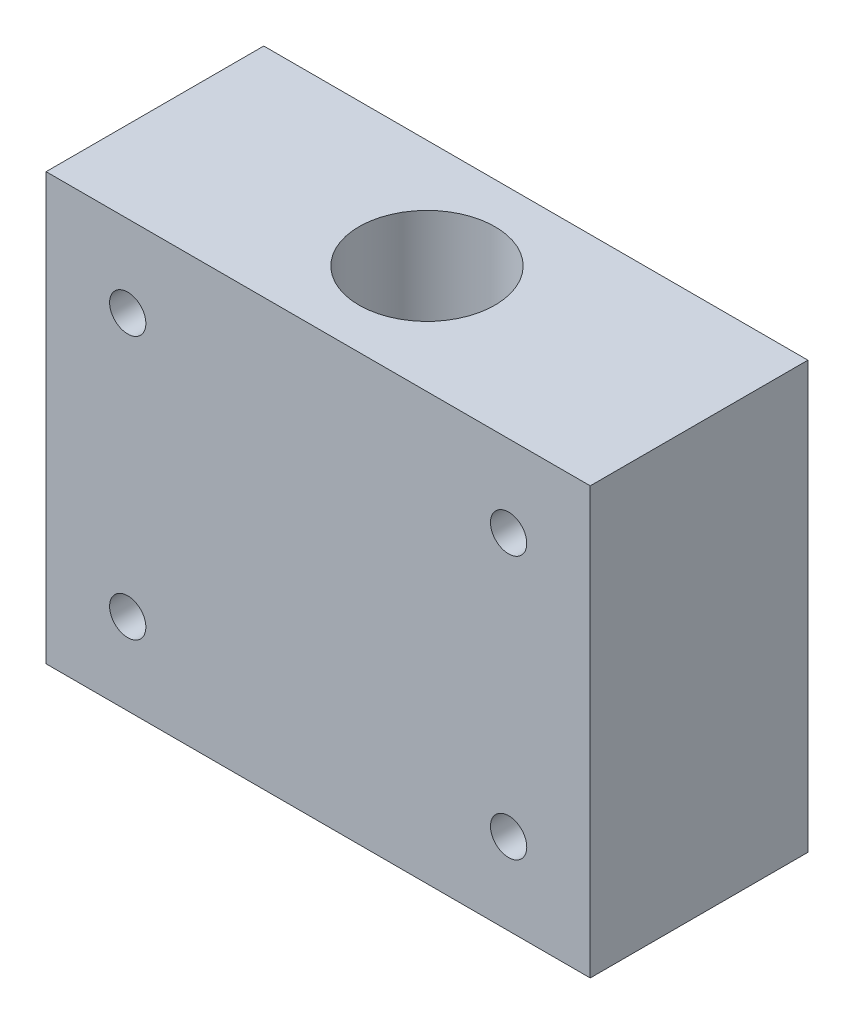
ISO-10303-21;
HEADER;
FILE_DESCRIPTION(('STEP AP214'),'2;1');
FILE_NAME('part.step','',(''),(''),'','','');
FILE_SCHEMA(('AUTOMOTIVE_DESIGN { 1 0 10303 214 1 1 1 1 }'));
ENDSEC;
DATA;
#1=APPLICATION_CONTEXT('core data for automotive mechanical design processes');
#2=APPLICATION_PROTOCOL_DEFINITION('international standard','automotive_design',2000,#1);
#3=PRODUCT_CONTEXT('',#1,'mechanical');
#4=PRODUCT('Part','Part','',(#3));
#5=PRODUCT_RELATED_PRODUCT_CATEGORY('part','',(#4));
#6=PRODUCT_DEFINITION_FORMATION('','',#4);
#7=PRODUCT_DEFINITION_CONTEXT('part definition',#1,'design');
#8=PRODUCT_DEFINITION('design','',#6,#7);
#9=PRODUCT_DEFINITION_SHAPE('','',#8);
#10=(LENGTH_UNIT() NAMED_UNIT(*) SI_UNIT(.MILLI.,.METRE.));
#11=(NAMED_UNIT(*) PLANE_ANGLE_UNIT() SI_UNIT($,.RADIAN.));
#12=(NAMED_UNIT(*) SI_UNIT($,.STERADIAN.) SOLID_ANGLE_UNIT());
#13=UNCERTAINTY_MEASURE_WITH_UNIT(LENGTH_MEASURE(1.E-05),#10,'distance_accuracy_value','');
#14=(GEOMETRIC_REPRESENTATION_CONTEXT(3) GLOBAL_UNCERTAINTY_ASSIGNED_CONTEXT((#13)) GLOBAL_UNIT_ASSIGNED_CONTEXT((#10,
#11,#12)) REPRESENTATION_CONTEXT('',''));
#15=CARTESIAN_POINT('',(0.,0.,0.));
#16=DIRECTION('',(0.,0.,1.));
#17=DIRECTION('',(1.,0.,0.));
#18=AXIS2_PLACEMENT_3D('',#15,#16,#17);
#19=CARTESIAN_POINT('',(0.,47.,0.));
#20=DIRECTION('',(0.,-1.,0.));
#21=DIRECTION('',(0.,0.,-1.));
#22=AXIS2_PLACEMENT_3D('',#19,#20,#21);
#23=PLANE('',#22);
#24=DIRECTION('',(0.,0.,-1.));
#25=VECTOR('',#24,1.);
#26=CARTESIAN_POINT('',(30.,47.,12.));
#27=LINE('',#26,#25);
#28=CARTESIAN_POINT('',(30.,47.,12.));
#29=VERTEX_POINT('',#28);
#30=CARTESIAN_POINT('',(30.,47.,-12.));
#31=VERTEX_POINT('',#30);
#32=EDGE_CURVE('E84',#29,#31,#27,.T.);
#33=ORIENTED_EDGE('',*,*,#32,.T.);
#34=DIRECTION('',(-1.,0.,0.));
#35=VECTOR('',#34,1.);
#36=CARTESIAN_POINT('',(-30.,47.,-12.));
#37=LINE('',#36,#35);
#38=CARTESIAN_POINT('',(-30.,47.,-12.));
#39=VERTEX_POINT('',#38);
#40=EDGE_CURVE('E80',#31,#39,#37,.T.);
#41=ORIENTED_EDGE('',*,*,#40,.T.);
#42=DIRECTION('',(0.,0.,1.));
#43=VECTOR('',#42,1.);
#44=CARTESIAN_POINT('',(-30.,47.,12.));
#45=LINE('',#44,#43);
#46=CARTESIAN_POINT('',(-30.,47.,12.));
#47=VERTEX_POINT('',#46);
#48=EDGE_CURVE('E83',#39,#47,#45,.T.);
#49=ORIENTED_EDGE('',*,*,#48,.T.);
#50=DIRECTION('',(1.,0.,0.));
#51=VECTOR('',#50,1.);
#52=CARTESIAN_POINT('',(-30.,47.,12.));
#53=LINE('',#52,#51);
#54=EDGE_CURVE('E52',#47,#29,#53,.T.);
#55=ORIENTED_EDGE('',*,*,#54,.T.);
#56=EDGE_LOOP('',(#33,#41,#49,#55));
#57=FACE_BOUND('',#56,.T.);
#58=CARTESIAN_POINT('',(0.,47.,0.));
#59=DIRECTION('',(0.,1.,0.));
#60=DIRECTION('',(0.,0.,1.));
#61=AXIS2_PLACEMENT_3D('',#58,#59,#60);
#62=CIRCLE('',#61,7.5);
#63=CARTESIAN_POINT('',(0.,47.,7.5));
#64=VERTEX_POINT('',#63);
#65=EDGE_CURVE('E100',#64,#64,#62,.T.);
#66=ORIENTED_EDGE('',*,*,#65,.F.);
#67=EDGE_LOOP('',(#66));
#68=FACE_BOUND('',#67,.T.);
#69=ADVANCED_FACE('F35',(#57,#68),#23,.F.);
#70=CARTESIAN_POINT('',(0.,0.,0.));
#71=DIRECTION('',(0.,-1.,0.));
#72=DIRECTION('',(0.,0.,-1.));
#73=AXIS2_PLACEMENT_3D('',#70,#71,#72);
#74=PLANE('',#73);
#75=DIRECTION('',(0.,0.,-1.));
#76=VECTOR('',#75,1.);
#77=CARTESIAN_POINT('',(30.,0.,12.));
#78=LINE('',#77,#76);
#79=CARTESIAN_POINT('',(30.,0.,12.));
#80=VERTEX_POINT('',#79);
#81=CARTESIAN_POINT('',(30.,0.,-12.));
#82=VERTEX_POINT('',#81);
#83=EDGE_CURVE('E98',#80,#82,#78,.T.);
#84=ORIENTED_EDGE('',*,*,#83,.F.);
#85=DIRECTION('',(1.,0.,0.));
#86=VECTOR('',#85,1.);
#87=CARTESIAN_POINT('',(-30.,0.,12.));
#88=LINE('',#87,#86);
#89=CARTESIAN_POINT('',(-30.,0.,12.));
#90=VERTEX_POINT('',#89);
#91=EDGE_CURVE('E104',#90,#80,#88,.T.);
#92=ORIENTED_EDGE('',*,*,#91,.F.);
#93=DIRECTION('',(0.,0.,1.));
#94=VECTOR('',#93,1.);
#95=CARTESIAN_POINT('',(-30.,0.,12.));
#96=LINE('',#95,#94);
#97=CARTESIAN_POINT('',(-30.,0.,-12.));
#98=VERTEX_POINT('',#97);
#99=EDGE_CURVE('E102',#98,#90,#96,.T.);
#100=ORIENTED_EDGE('',*,*,#99,.F.);
#101=DIRECTION('',(-1.,0.,0.));
#102=VECTOR('',#101,1.);
#103=CARTESIAN_POINT('',(-30.,0.,-12.));
#104=LINE('',#103,#102);
#105=EDGE_CURVE('E90',#82,#98,#104,.T.);
#106=ORIENTED_EDGE('',*,*,#105,.F.);
#107=EDGE_LOOP('',(#84,#92,#100,#106));
#108=FACE_BOUND('',#107,.T.);
#109=CARTESIAN_POINT('',(0.,0.,0.));
#110=DIRECTION('',(0.,1.,0.));
#111=DIRECTION('',(0.,0.,1.));
#112=AXIS2_PLACEMENT_3D('',#109,#110,#111);
#113=CIRCLE('',#112,7.5);
#114=CARTESIAN_POINT('',(0.,0.,7.5));
#115=VERTEX_POINT('',#114);
#116=EDGE_CURVE('E110',#115,#115,#113,.T.);
#117=ORIENTED_EDGE('',*,*,#116,.T.);
#118=EDGE_LOOP('',(#117));
#119=FACE_BOUND('',#118,.T.);
#120=ADVANCED_FACE('F175',(#108,#119),#74,.T.);
#121=CARTESIAN_POINT('',(30.,47.,12.));
#122=DIRECTION('',(-1.,0.,0.));
#123=DIRECTION('',(0.,0.,1.));
#124=AXIS2_PLACEMENT_3D('',#121,#122,#123);
#125=PLANE('',#124);
#126=ORIENTED_EDGE('',*,*,#83,.T.);
#127=DIRECTION('',(0.,-1.,0.));
#128=VECTOR('',#127,1.);
#129=CARTESIAN_POINT('',(30.,47.,-12.));
#130=LINE('',#129,#128);
#131=EDGE_CURVE('E11',#31,#82,#130,.T.);
#132=ORIENTED_EDGE('',*,*,#131,.F.);
#133=ORIENTED_EDGE('',*,*,#32,.F.);
#134=DIRECTION('',(0.,-1.,0.));
#135=VECTOR('',#134,1.);
#136=CARTESIAN_POINT('',(30.,47.,12.));
#137=LINE('',#136,#135);
#138=EDGE_CURVE('E74',#29,#80,#137,.T.);
#139=ORIENTED_EDGE('',*,*,#138,.T.);
#140=EDGE_LOOP('',(#126,#132,#133,#139));
#141=FACE_BOUND('',#140,.T.);
#142=ADVANCED_FACE('F37',(#141),#125,.F.);
#143=CARTESIAN_POINT('',(-30.,47.,-12.));
#144=DIRECTION('',(0.,0.,1.));
#145=DIRECTION('',(1.,0.,0.));
#146=AXIS2_PLACEMENT_3D('',#143,#144,#145);
#147=PLANE('',#146);
#148=CARTESIAN_POINT('',(21.,9.00000000000012,-12.));
#149=DIRECTION('',(0.,0.,1.));
#150=DIRECTION('',(1.,0.,0.));
#151=AXIS2_PLACEMENT_3D('',#148,#149,#150);
#152=CIRCLE('',#151,2.);
#153=CARTESIAN_POINT('',(23.,9.00000000000012,-12.));
#154=VERTEX_POINT('',#153);
#155=EDGE_CURVE('E131',#154,#154,#152,.T.);
#156=ORIENTED_EDGE('',*,*,#155,.T.);
#157=EDGE_LOOP('',(#156));
#158=FACE_BOUND('',#157,.T.);
#159=CARTESIAN_POINT('',(21.,37.9999999999999,-12.));
#160=DIRECTION('',(0.,0.,1.));
#161=DIRECTION('',(1.,0.,0.));
#162=AXIS2_PLACEMENT_3D('',#159,#160,#161);
#163=CIRCLE('',#162,2.);
#164=CARTESIAN_POINT('',(23.,37.9999999999999,-12.));
#165=VERTEX_POINT('',#164);
#166=EDGE_CURVE('E125',#165,#165,#163,.T.);
#167=ORIENTED_EDGE('',*,*,#166,.T.);
#168=EDGE_LOOP('',(#167));
#169=FACE_BOUND('',#168,.T.);
#170=CARTESIAN_POINT('',(-21.,37.9999999999999,-12.));
#171=DIRECTION('',(0.,0.,1.));
#172=DIRECTION('',(1.,0.,0.));
#173=AXIS2_PLACEMENT_3D('',#170,#171,#172);
#174=CIRCLE('',#173,2.);
#175=CARTESIAN_POINT('',(-19.,37.9999999999999,-12.));
#176=VERTEX_POINT('',#175);
#177=EDGE_CURVE('E119',#176,#176,#174,.T.);
#178=ORIENTED_EDGE('',*,*,#177,.T.);
#179=EDGE_LOOP('',(#178));
#180=FACE_BOUND('',#179,.T.);
#181=CARTESIAN_POINT('',(-21.,9.00000000000012,-12.));
#182=DIRECTION('',(0.,0.,1.));
#183=DIRECTION('',(1.,0.,0.));
#184=AXIS2_PLACEMENT_3D('',#181,#182,#183);
#185=CIRCLE('',#184,2.);
#186=CARTESIAN_POINT('',(-19.,9.00000000000012,-12.));
#187=VERTEX_POINT('',#186);
#188=EDGE_CURVE('E113',#187,#187,#185,.T.);
#189=ORIENTED_EDGE('',*,*,#188,.T.);
#190=EDGE_LOOP('',(#189));
#191=FACE_BOUND('',#190,.T.);
#192=ORIENTED_EDGE('',*,*,#105,.T.);
#193=DIRECTION('',(0.,-1.,0.));
#194=VECTOR('',#193,1.);
#195=CARTESIAN_POINT('',(-30.,47.,-12.));
#196=LINE('',#195,#194);
#197=EDGE_CURVE('E44',#39,#98,#196,.T.);
#198=ORIENTED_EDGE('',*,*,#197,.F.);
#199=ORIENTED_EDGE('',*,*,#40,.F.);
#200=ORIENTED_EDGE('',*,*,#131,.T.);
#201=EDGE_LOOP('',(#192,#198,#199,#200));
#202=FACE_BOUND('',#201,.T.);
#203=ADVANCED_FACE('F88',(#158,#169,#180,#191,#202),#147,.F.);
#204=CARTESIAN_POINT('',(-30.,47.,12.));
#205=DIRECTION('',(1.,0.,0.));
#206=DIRECTION('',(0.,0.,-1.));
#207=AXIS2_PLACEMENT_3D('',#204,#205,#206);
#208=PLANE('',#207);
#209=ORIENTED_EDGE('',*,*,#99,.T.);
#210=DIRECTION('',(0.,-1.,0.));
#211=VECTOR('',#210,1.);
#212=CARTESIAN_POINT('',(-30.,47.,12.));
#213=LINE('',#212,#211);
#214=EDGE_CURVE('E67',#47,#90,#213,.T.);
#215=ORIENTED_EDGE('',*,*,#214,.F.);
#216=ORIENTED_EDGE('',*,*,#48,.F.);
#217=ORIENTED_EDGE('',*,*,#197,.T.);
#218=EDGE_LOOP('',(#209,#215,#216,#217));
#219=FACE_BOUND('',#218,.T.);
#220=ADVANCED_FACE('F93',(#219),#208,.F.);
#221=CARTESIAN_POINT('',(-30.,47.,12.));
#222=DIRECTION('',(0.,0.,-1.));
#223=DIRECTION('',(-1.,0.,0.));
#224=AXIS2_PLACEMENT_3D('',#221,#222,#223);
#225=PLANE('',#224);
#226=CARTESIAN_POINT('',(21.,9.00000000000012,12.));
#227=DIRECTION('',(0.,0.,1.));
#228=DIRECTION('',(1.,0.,0.));
#229=AXIS2_PLACEMENT_3D('',#226,#227,#228);
#230=CIRCLE('',#229,2.);
#231=CARTESIAN_POINT('',(23.,9.00000000000012,12.));
#232=VERTEX_POINT('',#231);
#233=EDGE_CURVE('E134',#232,#232,#230,.T.);
#234=ORIENTED_EDGE('',*,*,#233,.F.);
#235=EDGE_LOOP('',(#234));
#236=FACE_BOUND('',#235,.T.);
#237=CARTESIAN_POINT('',(21.,37.9999999999999,12.));
#238=DIRECTION('',(0.,0.,1.));
#239=DIRECTION('',(1.,0.,0.));
#240=AXIS2_PLACEMENT_3D('',#237,#238,#239);
#241=CIRCLE('',#240,2.);
#242=CARTESIAN_POINT('',(23.,37.9999999999999,12.));
#243=VERTEX_POINT('',#242);
#244=EDGE_CURVE('E128',#243,#243,#241,.T.);
#245=ORIENTED_EDGE('',*,*,#244,.F.);
#246=EDGE_LOOP('',(#245));
#247=FACE_BOUND('',#246,.T.);
#248=CARTESIAN_POINT('',(-21.,37.9999999999999,12.));
#249=DIRECTION('',(0.,0.,1.));
#250=DIRECTION('',(1.,0.,0.));
#251=AXIS2_PLACEMENT_3D('',#248,#249,#250);
#252=CIRCLE('',#251,2.);
#253=CARTESIAN_POINT('',(-19.,37.9999999999999,12.));
#254=VERTEX_POINT('',#253);
#255=EDGE_CURVE('E122',#254,#254,#252,.T.);
#256=ORIENTED_EDGE('',*,*,#255,.F.);
#257=EDGE_LOOP('',(#256));
#258=FACE_BOUND('',#257,.T.);
#259=CARTESIAN_POINT('',(-21.,9.00000000000012,12.));
#260=DIRECTION('',(0.,0.,1.));
#261=DIRECTION('',(1.,0.,0.));
#262=AXIS2_PLACEMENT_3D('',#259,#260,#261);
#263=CIRCLE('',#262,2.);
#264=CARTESIAN_POINT('',(-19.,9.00000000000012,12.));
#265=VERTEX_POINT('',#264);
#266=EDGE_CURVE('E116',#265,#265,#263,.T.);
#267=ORIENTED_EDGE('',*,*,#266,.F.);
#268=EDGE_LOOP('',(#267));
#269=FACE_BOUND('',#268,.T.);
#270=ORIENTED_EDGE('',*,*,#91,.T.);
#271=ORIENTED_EDGE('',*,*,#138,.F.);
#272=ORIENTED_EDGE('',*,*,#54,.F.);
#273=ORIENTED_EDGE('',*,*,#214,.T.);
#274=EDGE_LOOP('',(#270,#271,#272,#273));
#275=FACE_BOUND('',#274,.T.);
#276=ADVANCED_FACE('F149',(#236,#247,#258,#269,#275),#225,.F.);
#277=CARTESIAN_POINT('',(0.,47.,0.));
#278=DIRECTION('',(0.,-1.,0.));
#279=DIRECTION('',(0.,0.,-1.));
#280=AXIS2_PLACEMENT_3D('',#277,#278,#279);
#281=CYLINDRICAL_SURFACE('',#280,7.5);
#282=ORIENTED_EDGE('',*,*,#116,.F.);
#283=EDGE_LOOP('',(#282));
#284=FACE_BOUND('',#283,.T.);
#285=ORIENTED_EDGE('',*,*,#65,.T.);
#286=EDGE_LOOP('',(#285));
#287=FACE_BOUND('',#286,.T.);
#288=ADVANCED_FACE('F152',(#284,#287),#281,.F.);
#289=CARTESIAN_POINT('',(-21.,9.00000000000012,-12.));
#290=DIRECTION('',(0.,0.,1.));
#291=DIRECTION('',(1.,0.,0.));
#292=AXIS2_PLACEMENT_3D('',#289,#290,#291);
#293=CYLINDRICAL_SURFACE('',#292,2.);
#294=ORIENTED_EDGE('',*,*,#188,.F.);
#295=EDGE_LOOP('',(#294));
#296=FACE_BOUND('',#295,.T.);
#297=ORIENTED_EDGE('',*,*,#266,.T.);
#298=EDGE_LOOP('',(#297));
#299=FACE_BOUND('',#298,.T.);
#300=ADVANCED_FACE('F160',(#296,#299),#293,.F.);
#301=CARTESIAN_POINT('',(-21.,37.9999999999999,-12.));
#302=DIRECTION('',(0.,0.,1.));
#303=DIRECTION('',(1.,0.,0.));
#304=AXIS2_PLACEMENT_3D('',#301,#302,#303);
#305=CYLINDRICAL_SURFACE('',#304,2.);
#306=ORIENTED_EDGE('',*,*,#177,.F.);
#307=EDGE_LOOP('',(#306));
#308=FACE_BOUND('',#307,.T.);
#309=ORIENTED_EDGE('',*,*,#255,.T.);
#310=EDGE_LOOP('',(#309));
#311=FACE_BOUND('',#310,.T.);
#312=ADVANCED_FACE('F162',(#308,#311),#305,.F.);
#313=CARTESIAN_POINT('',(21.,37.9999999999999,-12.));
#314=DIRECTION('',(0.,0.,1.));
#315=DIRECTION('',(1.,0.,0.));
#316=AXIS2_PLACEMENT_3D('',#313,#314,#315);
#317=CYLINDRICAL_SURFACE('',#316,2.);
#318=ORIENTED_EDGE('',*,*,#166,.F.);
#319=EDGE_LOOP('',(#318));
#320=FACE_BOUND('',#319,.T.);
#321=ORIENTED_EDGE('',*,*,#244,.T.);
#322=EDGE_LOOP('',(#321));
#323=FACE_BOUND('',#322,.T.);
#324=ADVANCED_FACE('F145',(#320,#323),#317,.F.);
#325=CARTESIAN_POINT('',(21.,9.00000000000012,-12.));
#326=DIRECTION('',(0.,0.,1.));
#327=DIRECTION('',(1.,0.,0.));
#328=AXIS2_PLACEMENT_3D('',#325,#326,#327);
#329=CYLINDRICAL_SURFACE('',#328,2.);
#330=ORIENTED_EDGE('',*,*,#155,.F.);
#331=EDGE_LOOP('',(#330));
#332=FACE_BOUND('',#331,.T.);
#333=ORIENTED_EDGE('',*,*,#233,.T.);
#334=EDGE_LOOP('',(#333));
#335=FACE_BOUND('',#334,.T.);
#336=ADVANCED_FACE('F142',(#332,#335),#329,.F.);
#337=CLOSED_SHELL('',(#69,#120,#142,#203,#220,#276,#288,#300,#312,#324,#336));
#338=MANIFOLD_SOLID_BREP('B2',#337);
#339=ADVANCED_BREP_SHAPE_REPRESENTATION('',(#18,#338),#14);
#340=SHAPE_DEFINITION_REPRESENTATION(#9,#339);
ENDSEC;
END-ISO-10303-21;
